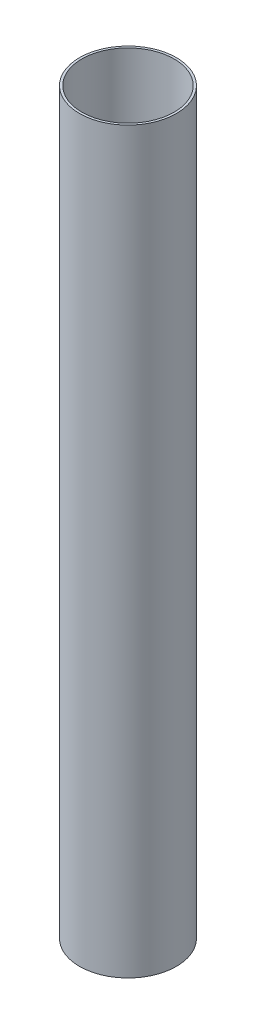
ISO-10303-21;
HEADER;
FILE_DESCRIPTION(('STEP AP214'),'2;1');
FILE_NAME('part.step','',(''),(''),'','','');
FILE_SCHEMA(('AUTOMOTIVE_DESIGN { 1 0 10303 214 1 1 1 1 }'));
ENDSEC;
DATA;
#1=APPLICATION_CONTEXT('core data for automotive mechanical design processes');
#2=APPLICATION_PROTOCOL_DEFINITION('international standard','automotive_design',2000,#1);
#3=PRODUCT_CONTEXT('',#1,'mechanical');
#4=PRODUCT('Part','Part','',(#3));
#5=PRODUCT_RELATED_PRODUCT_CATEGORY('part','',(#4));
#6=PRODUCT_DEFINITION_FORMATION('','',#4);
#7=PRODUCT_DEFINITION_CONTEXT('part definition',#1,'design');
#8=PRODUCT_DEFINITION('design','',#6,#7);
#9=PRODUCT_DEFINITION_SHAPE('','',#8);
#10=(LENGTH_UNIT() NAMED_UNIT(*) SI_UNIT(.MILLI.,.METRE.));
#11=(NAMED_UNIT(*) PLANE_ANGLE_UNIT() SI_UNIT($,.RADIAN.));
#12=(NAMED_UNIT(*) SI_UNIT($,.STERADIAN.) SOLID_ANGLE_UNIT());
#13=UNCERTAINTY_MEASURE_WITH_UNIT(LENGTH_MEASURE(1.E-05),#10,'distance_accuracy_value','');
#14=(GEOMETRIC_REPRESENTATION_CONTEXT(3) GLOBAL_UNCERTAINTY_ASSIGNED_CONTEXT((#13)) GLOBAL_UNIT_ASSIGNED_CONTEXT((#10,
#11,#12)) REPRESENTATION_CONTEXT('',''));
#15=CARTESIAN_POINT('',(0.,0.,0.));
#16=DIRECTION('',(0.,0.,1.));
#17=DIRECTION('',(1.,0.,0.));
#18=AXIS2_PLACEMENT_3D('',#15,#16,#17);
#19=CARTESIAN_POINT('',(0.,508.,0.));
#20=DIRECTION('',(0.,1.,0.));
#21=DIRECTION('',(0.,0.,1.));
#22=AXIS2_PLACEMENT_3D('',#19,#20,#21);
#23=PLANE('',#22);
#24=CARTESIAN_POINT('',(0.,508.,0.));
#25=DIRECTION('',(0.,1.,0.));
#26=DIRECTION('',(0.,0.,1.));
#27=AXIS2_PLACEMENT_3D('',#24,#25,#26);
#28=CIRCLE('',#27,33.3248);
#29=CARTESIAN_POINT('',(0.,508.,33.3248));
#30=VERTEX_POINT('',#29);
#31=EDGE_CURVE('E10',#30,#30,#28,.T.);
#32=ORIENTED_EDGE('',*,*,#31,.T.);
#33=EDGE_LOOP('',(#32));
#34=FACE_BOUND('',#33,.T.);
#35=CARTESIAN_POINT('',(0.,508.,0.));
#36=DIRECTION('',(0.,1.,0.));
#37=DIRECTION('',(0.,0.,1.));
#38=AXIS2_PLACEMENT_3D('',#35,#36,#37);
#39=CIRCLE('',#38,31.75);
#40=CARTESIAN_POINT('',(0.,508.,31.75));
#41=VERTEX_POINT('',#40);
#42=EDGE_CURVE('E41',#41,#41,#39,.T.);
#43=ORIENTED_EDGE('',*,*,#42,.F.);
#44=EDGE_LOOP('',(#43));
#45=FACE_BOUND('',#44,.T.);
#46=ADVANCED_FACE('F30',(#34,#45),#23,.T.);
#47=CARTESIAN_POINT('',(0.,0.,0.));
#48=DIRECTION('',(0.,1.,0.));
#49=DIRECTION('',(0.,0.,1.));
#50=AXIS2_PLACEMENT_3D('',#47,#48,#49);
#51=PLANE('',#50);
#52=CARTESIAN_POINT('',(0.,0.,0.));
#53=DIRECTION('',(0.,1.,0.));
#54=DIRECTION('',(0.,0.,1.));
#55=AXIS2_PLACEMENT_3D('',#52,#53,#54);
#56=CIRCLE('',#55,33.3248);
#57=CARTESIAN_POINT('',(0.,0.,33.3248));
#58=VERTEX_POINT('',#57);
#59=EDGE_CURVE('E34',#58,#58,#56,.T.);
#60=ORIENTED_EDGE('',*,*,#59,.F.);
#61=EDGE_LOOP('',(#60));
#62=FACE_BOUND('',#61,.T.);
#63=CARTESIAN_POINT('',(0.,0.,0.));
#64=DIRECTION('',(0.,1.,0.));
#65=DIRECTION('',(0.,0.,1.));
#66=AXIS2_PLACEMENT_3D('',#63,#64,#65);
#67=CIRCLE('',#66,31.75);
#68=CARTESIAN_POINT('',(0.,0.,31.75));
#69=VERTEX_POINT('',#68);
#70=EDGE_CURVE('E43',#69,#69,#67,.T.);
#71=ORIENTED_EDGE('',*,*,#70,.T.);
#72=EDGE_LOOP('',(#71));
#73=FACE_BOUND('',#72,.T.);
#74=ADVANCED_FACE('F53',(#62,#73),#51,.F.);
#75=CARTESIAN_POINT('',(0.,508.,0.));
#76=DIRECTION('',(0.,-1.,0.));
#77=DIRECTION('',(0.,0.,-1.));
#78=AXIS2_PLACEMENT_3D('',#75,#76,#77);
#79=CYLINDRICAL_SURFACE('',#78,33.3248);
#80=ORIENTED_EDGE('',*,*,#31,.F.);
#81=EDGE_LOOP('',(#80));
#82=FACE_BOUND('',#81,.T.);
#83=ORIENTED_EDGE('',*,*,#59,.T.);
#84=EDGE_LOOP('',(#83));
#85=FACE_BOUND('',#84,.T.);
#86=ADVANCED_FACE('F32',(#82,#85),#79,.T.);
#87=CARTESIAN_POINT('',(0.,508.,0.));
#88=DIRECTION('',(0.,-1.,0.));
#89=DIRECTION('',(0.,0.,-1.));
#90=AXIS2_PLACEMENT_3D('',#87,#88,#89);
#91=CYLINDRICAL_SURFACE('',#90,31.75);
#92=ORIENTED_EDGE('',*,*,#42,.T.);
#93=EDGE_LOOP('',(#92));
#94=FACE_BOUND('',#93,.T.);
#95=ORIENTED_EDGE('',*,*,#70,.F.);
#96=EDGE_LOOP('',(#95));
#97=FACE_BOUND('',#96,.T.);
#98=ADVANCED_FACE('F49',(#94,#97),#91,.F.);
#99=CLOSED_SHELL('',(#46,#74,#86,#98));
#100=MANIFOLD_SOLID_BREP('B2',#99);
#101=ADVANCED_BREP_SHAPE_REPRESENTATION('',(#18,#100),#14);
#102=SHAPE_DEFINITION_REPRESENTATION(#9,#101);
ENDSEC;
END-ISO-10303-21;
